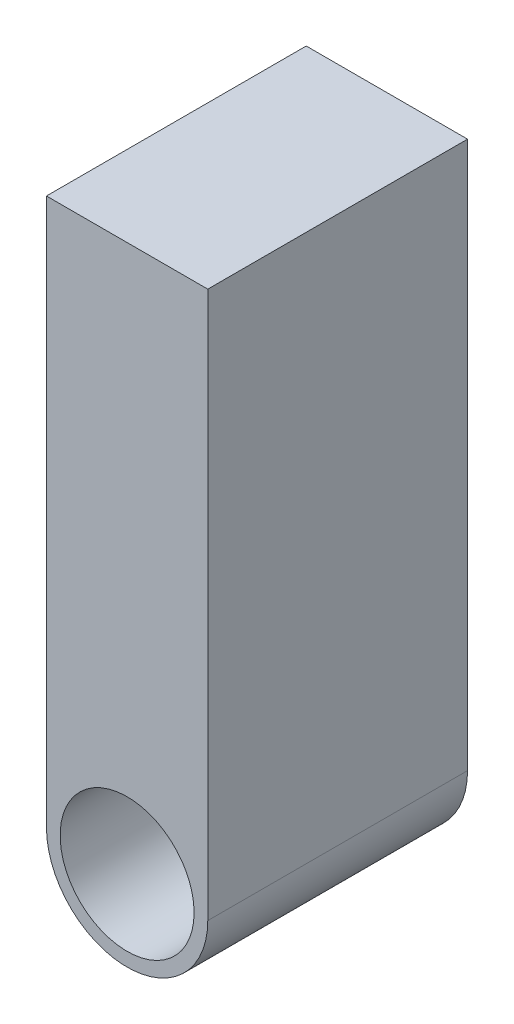
ISO-10303-21;
HEADER;
FILE_DESCRIPTION(('STEP AP214'),'2;1');
FILE_NAME('part.step','',(''),(''),'','','');
FILE_SCHEMA(('AUTOMOTIVE_DESIGN { 1 0 10303 214 1 1 1 1 }'));
ENDSEC;
DATA;
#1=APPLICATION_CONTEXT('core data for automotive mechanical design processes');
#2=APPLICATION_PROTOCOL_DEFINITION('international standard','automotive_design',2000,#1);
#3=PRODUCT_CONTEXT('',#1,'mechanical');
#4=PRODUCT('Part','Part','',(#3));
#5=PRODUCT_RELATED_PRODUCT_CATEGORY('part','',(#4));
#6=PRODUCT_DEFINITION_FORMATION('','',#4);
#7=PRODUCT_DEFINITION_CONTEXT('part definition',#1,'design');
#8=PRODUCT_DEFINITION('design','',#6,#7);
#9=PRODUCT_DEFINITION_SHAPE('','',#8);
#10=(LENGTH_UNIT() NAMED_UNIT(*) SI_UNIT(.MILLI.,.METRE.));
#11=(NAMED_UNIT(*) PLANE_ANGLE_UNIT() SI_UNIT($,.RADIAN.));
#12=(NAMED_UNIT(*) SI_UNIT($,.STERADIAN.) SOLID_ANGLE_UNIT());
#13=UNCERTAINTY_MEASURE_WITH_UNIT(LENGTH_MEASURE(1.E-05),#10,'distance_accuracy_value','');
#14=(GEOMETRIC_REPRESENTATION_CONTEXT(3) GLOBAL_UNCERTAINTY_ASSIGNED_CONTEXT((#13)) GLOBAL_UNIT_ASSIGNED_CONTEXT((#10,
#11,#12)) REPRESENTATION_CONTEXT('',''));
#15=CARTESIAN_POINT('',(0.,0.,0.));
#16=DIRECTION('',(0.,0.,1.));
#17=DIRECTION('',(1.,0.,0.));
#18=AXIS2_PLACEMENT_3D('',#15,#16,#17);
#19=CARTESIAN_POINT('',(0.,0.,48.26));
#20=DIRECTION('',(0.,0.,-1.));
#21=DIRECTION('',(-1.,0.,0.));
#22=AXIS2_PLACEMENT_3D('',#19,#20,#21);
#23=CYLINDRICAL_SURFACE('',#22,14.986);
#24=CARTESIAN_POINT('',(0.,0.,0.));
#25=DIRECTION('',(0.,0.,1.));
#26=DIRECTION('',(1.,0.,0.));
#27=AXIS2_PLACEMENT_3D('',#24,#25,#26);
#28=CIRCLE('',#27,14.986);
#29=CARTESIAN_POINT('',(-14.986,0.,0.));
#30=VERTEX_POINT('',#29);
#31=CARTESIAN_POINT('',(14.986,0.,0.));
#32=VERTEX_POINT('',#31);
#33=EDGE_CURVE('E115',#30,#32,#28,.T.);
#34=ORIENTED_EDGE('',*,*,#33,.T.);
#35=DIRECTION('',(0.,0.,-1.));
#36=VECTOR('',#35,1.);
#37=CARTESIAN_POINT('',(14.986,0.,48.26));
#38=LINE('',#37,#36);
#39=CARTESIAN_POINT('',(14.986,0.,48.26));
#40=VERTEX_POINT('',#39);
#41=EDGE_CURVE('E11',#40,#32,#38,.T.);
#42=ORIENTED_EDGE('',*,*,#41,.F.);
#43=CARTESIAN_POINT('',(0.,0.,48.26));
#44=DIRECTION('',(0.,0.,1.));
#45=DIRECTION('',(1.,0.,0.));
#46=AXIS2_PLACEMENT_3D('',#43,#44,#45);
#47=CIRCLE('',#46,14.986);
#48=CARTESIAN_POINT('',(-14.986,0.,48.26));
#49=VERTEX_POINT('',#48);
#50=EDGE_CURVE('E98',#49,#40,#47,.T.);
#51=ORIENTED_EDGE('',*,*,#50,.F.);
#52=DIRECTION('',(0.,0.,-1.));
#53=VECTOR('',#52,1.);
#54=CARTESIAN_POINT('',(-14.986,0.,48.26));
#55=LINE('',#54,#53);
#56=EDGE_CURVE('E111',#49,#30,#55,.T.);
#57=ORIENTED_EDGE('',*,*,#56,.T.);
#58=EDGE_LOOP('',(#34,#42,#51,#57));
#59=FACE_BOUND('',#58,.T.);
#60=ADVANCED_FACE('F45',(#59),#23,.T.);
#61=CARTESIAN_POINT('',(14.986,101.6,48.26));
#62=DIRECTION('',(-1.,0.,0.));
#63=DIRECTION('',(0.,-1.,0.));
#64=AXIS2_PLACEMENT_3D('',#61,#62,#63);
#65=PLANE('',#64);
#66=DIRECTION('',(0.,1.,0.));
#67=VECTOR('',#66,1.);
#68=CARTESIAN_POINT('',(14.986,101.6,0.));
#69=LINE('',#68,#67);
#70=CARTESIAN_POINT('',(14.986,101.6,0.));
#71=VERTEX_POINT('',#70);
#72=EDGE_CURVE('E103',#32,#71,#69,.T.);
#73=ORIENTED_EDGE('',*,*,#72,.T.);
#74=DIRECTION('',(0.,0.,-1.));
#75=VECTOR('',#74,1.);
#76=CARTESIAN_POINT('',(14.986,101.6,48.26));
#77=LINE('',#76,#75);
#78=CARTESIAN_POINT('',(14.986,101.6,48.26));
#79=VERTEX_POINT('',#78);
#80=EDGE_CURVE('E55',#79,#71,#77,.T.);
#81=ORIENTED_EDGE('',*,*,#80,.F.);
#82=DIRECTION('',(0.,1.,0.));
#83=VECTOR('',#82,1.);
#84=CARTESIAN_POINT('',(14.986,101.6,48.26));
#85=LINE('',#84,#83);
#86=EDGE_CURVE('E93',#40,#79,#85,.T.);
#87=ORIENTED_EDGE('',*,*,#86,.F.);
#88=ORIENTED_EDGE('',*,*,#41,.T.);
#89=EDGE_LOOP('',(#73,#81,#87,#88));
#90=FACE_BOUND('',#89,.T.);
#91=ADVANCED_FACE('F102',(#90),#65,.F.);
#92=CARTESIAN_POINT('',(-14.986,101.6,48.26));
#93=DIRECTION('',(0.,-1.,0.));
#94=DIRECTION('',(0.,0.,-1.));
#95=AXIS2_PLACEMENT_3D('',#92,#93,#94);
#96=PLANE('',#95);
#97=DIRECTION('',(-1.,0.,0.));
#98=VECTOR('',#97,1.);
#99=CARTESIAN_POINT('',(-14.986,101.6,0.));
#100=LINE('',#99,#98);
#101=CARTESIAN_POINT('',(-14.986,101.6,0.));
#102=VERTEX_POINT('',#101);
#103=EDGE_CURVE('E80',#71,#102,#100,.T.);
#104=ORIENTED_EDGE('',*,*,#103,.T.);
#105=DIRECTION('',(0.,0.,-1.));
#106=VECTOR('',#105,1.);
#107=CARTESIAN_POINT('',(-14.986,101.6,48.26));
#108=LINE('',#107,#106);
#109=CARTESIAN_POINT('',(-14.986,101.6,48.26));
#110=VERTEX_POINT('',#109);
#111=EDGE_CURVE('E105',#110,#102,#108,.T.);
#112=ORIENTED_EDGE('',*,*,#111,.F.);
#113=DIRECTION('',(-1.,0.,0.));
#114=VECTOR('',#113,1.);
#115=CARTESIAN_POINT('',(-14.986,101.6,48.26));
#116=LINE('',#115,#114);
#117=EDGE_CURVE('E96',#79,#110,#116,.T.);
#118=ORIENTED_EDGE('',*,*,#117,.F.);
#119=ORIENTED_EDGE('',*,*,#80,.T.);
#120=EDGE_LOOP('',(#104,#112,#118,#119));
#121=FACE_BOUND('',#120,.T.);
#122=ADVANCED_FACE('F107',(#121),#96,.F.);
#123=CARTESIAN_POINT('',(-14.986,0.,48.26));
#124=DIRECTION('',(1.,0.,0.));
#125=DIRECTION('',(0.,1.,0.));
#126=AXIS2_PLACEMENT_3D('',#123,#124,#125);
#127=PLANE('',#126);
#128=DIRECTION('',(0.,-1.,0.));
#129=VECTOR('',#128,1.);
#130=CARTESIAN_POINT('',(-14.986,0.,0.));
#131=LINE('',#130,#129);
#132=EDGE_CURVE('E86',#102,#30,#131,.T.);
#133=ORIENTED_EDGE('',*,*,#132,.T.);
#134=ORIENTED_EDGE('',*,*,#56,.F.);
#135=DIRECTION('',(0.,-1.,0.));
#136=VECTOR('',#135,1.);
#137=CARTESIAN_POINT('',(-14.986,0.,48.26));
#138=LINE('',#137,#136);
#139=EDGE_CURVE('E63',#110,#49,#138,.T.);
#140=ORIENTED_EDGE('',*,*,#139,.F.);
#141=ORIENTED_EDGE('',*,*,#111,.T.);
#142=EDGE_LOOP('',(#133,#134,#140,#141));
#143=FACE_BOUND('',#142,.T.);
#144=ADVANCED_FACE('F129',(#143),#127,.F.);
#145=CARTESIAN_POINT('',(0.,0.,48.26));
#146=DIRECTION('',(0.,0.,1.));
#147=DIRECTION('',(1.,0.,0.));
#148=AXIS2_PLACEMENT_3D('',#145,#146,#147);
#149=PLANE('',#148);
#150=CARTESIAN_POINT('',(0.,0.,48.26));
#151=DIRECTION('',(0.,0.,1.));
#152=DIRECTION('',(1.,0.,0.));
#153=AXIS2_PLACEMENT_3D('',#150,#151,#152);
#154=CIRCLE('',#153,12.446);
#155=CARTESIAN_POINT('',(12.446,0.,48.26));
#156=VERTEX_POINT('',#155);
#157=EDGE_CURVE('E136',#156,#156,#154,.T.);
#158=ORIENTED_EDGE('',*,*,#157,.F.);
#159=EDGE_LOOP('',(#158));
#160=FACE_BOUND('',#159,.T.);
#161=ORIENTED_EDGE('',*,*,#50,.T.);
#162=ORIENTED_EDGE('',*,*,#86,.T.);
#163=ORIENTED_EDGE('',*,*,#117,.T.);
#164=ORIENTED_EDGE('',*,*,#139,.T.);
#165=EDGE_LOOP('',(#161,#162,#163,#164));
#166=FACE_BOUND('',#165,.T.);
#167=ADVANCED_FACE('F94',(#160,#166),#149,.T.);
#168=CARTESIAN_POINT('',(0.,0.,0.));
#169=DIRECTION('',(0.,0.,1.));
#170=DIRECTION('',(1.,0.,0.));
#171=AXIS2_PLACEMENT_3D('',#168,#169,#170);
#172=PLANE('',#171);
#173=CARTESIAN_POINT('',(0.,0.,0.));
#174=DIRECTION('',(0.,0.,-1.));
#175=DIRECTION('',(-1.,0.,0.));
#176=AXIS2_PLACEMENT_3D('',#173,#174,#175);
#177=CIRCLE('',#176,3.175);
#178=CARTESIAN_POINT('',(-3.175,0.,0.));
#179=VERTEX_POINT('',#178);
#180=EDGE_CURVE('E143',#179,#179,#177,.T.);
#181=ORIENTED_EDGE('',*,*,#180,.F.);
#182=EDGE_LOOP('',(#181));
#183=FACE_BOUND('',#182,.T.);
#184=ORIENTED_EDGE('',*,*,#33,.F.);
#185=ORIENTED_EDGE('',*,*,#132,.F.);
#186=ORIENTED_EDGE('',*,*,#103,.F.);
#187=ORIENTED_EDGE('',*,*,#72,.F.);
#188=EDGE_LOOP('',(#184,#185,#186,#187));
#189=FACE_BOUND('',#188,.T.);
#190=ADVANCED_FACE('F132',(#183,#189),#172,.F.);
#191=CARTESIAN_POINT('',(0.,0.,4.064));
#192=DIRECTION('',(0.,0.,1.));
#193=DIRECTION('',(1.,0.,0.));
#194=AXIS2_PLACEMENT_3D('',#191,#192,#193);
#195=CYLINDRICAL_SURFACE('',#194,12.446);
#196=CARTESIAN_POINT('',(0.,0.,4.064));
#197=DIRECTION('',(0.,0.,1.));
#198=DIRECTION('',(1.,0.,0.));
#199=AXIS2_PLACEMENT_3D('',#196,#197,#198);
#200=CIRCLE('',#199,12.446);
#201=CARTESIAN_POINT('',(12.446,0.,4.064));
#202=VERTEX_POINT('',#201);
#203=EDGE_CURVE('E119',#202,#202,#200,.T.);
#204=ORIENTED_EDGE('',*,*,#203,.F.);
#205=EDGE_LOOP('',(#204));
#206=FACE_BOUND('',#205,.T.);
#207=ORIENTED_EDGE('',*,*,#157,.T.);
#208=EDGE_LOOP('',(#207));
#209=FACE_BOUND('',#208,.T.);
#210=ADVANCED_FACE('F157',(#206,#209),#195,.F.);
#211=CARTESIAN_POINT('',(0.,0.,4.064));
#212=DIRECTION('',(0.,0.,1.));
#213=DIRECTION('',(1.,0.,0.));
#214=AXIS2_PLACEMENT_3D('',#211,#212,#213);
#215=PLANE('',#214);
#216=CARTESIAN_POINT('',(0.,0.,4.064));
#217=DIRECTION('',(0.,0.,1.));
#218=DIRECTION('',(1.,0.,0.));
#219=AXIS2_PLACEMENT_3D('',#216,#217,#218);
#220=CIRCLE('',#219,3.175);
#221=CARTESIAN_POINT('',(3.175,0.,4.064));
#222=VERTEX_POINT('',#221);
#223=EDGE_CURVE('E48',#222,#222,#220,.T.);
#224=ORIENTED_EDGE('',*,*,#223,.F.);
#225=EDGE_LOOP('',(#224));
#226=FACE_BOUND('',#225,.T.);
#227=ORIENTED_EDGE('',*,*,#203,.T.);
#228=EDGE_LOOP('',(#227));
#229=FACE_BOUND('',#228,.T.);
#230=ADVANCED_FACE('F154',(#226,#229),#215,.T.);
#231=CARTESIAN_POINT('',(0.,0.,40.64));
#232=DIRECTION('',(0.,0.,-1.));
#233=DIRECTION('',(-1.,0.,0.));
#234=AXIS2_PLACEMENT_3D('',#231,#232,#233);
#235=CYLINDRICAL_SURFACE('',#234,3.175);
#236=ORIENTED_EDGE('',*,*,#223,.T.);
#237=EDGE_LOOP('',(#236));
#238=FACE_BOUND('',#237,.T.);
#239=ORIENTED_EDGE('',*,*,#180,.T.);
#240=EDGE_LOOP('',(#239));
#241=FACE_BOUND('',#240,.T.);
#242=ADVANCED_FACE('F152',(#238,#241),#235,.F.);
#243=CLOSED_SHELL('',(#60,#91,#122,#144,#167,#190,#210,#230,#242));
#244=MANIFOLD_SOLID_BREP('B2',#243);
#245=ADVANCED_BREP_SHAPE_REPRESENTATION('',(#18,#244),#14);
#246=SHAPE_DEFINITION_REPRESENTATION(#9,#245);
ENDSEC;
END-ISO-10303-21;
